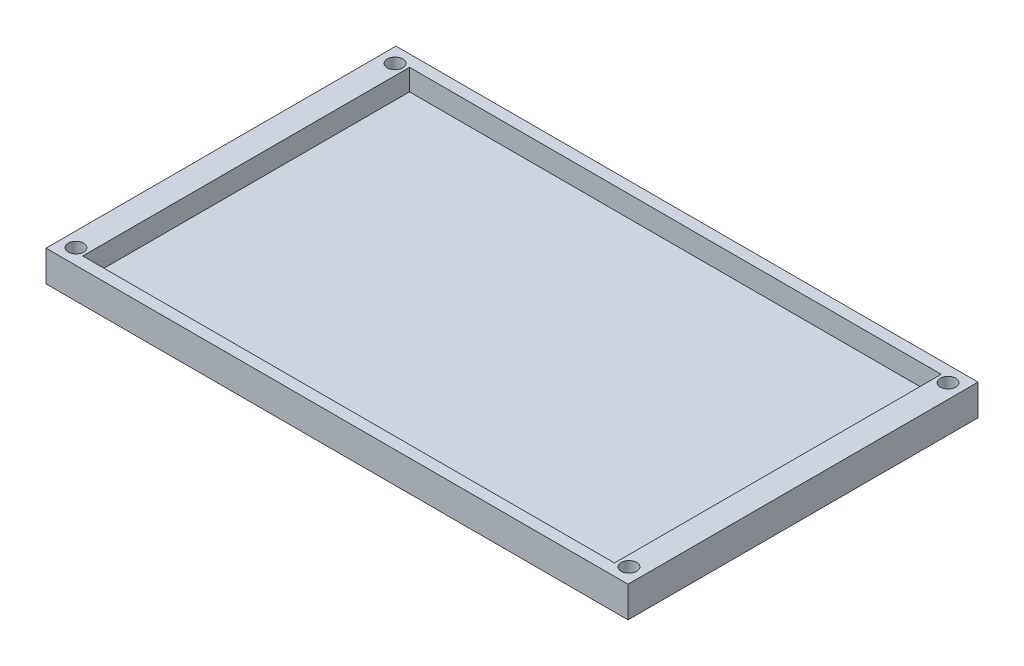
ISO-10303-21;
HEADER;
FILE_DESCRIPTION(('STEP AP214'),'2;1');
FILE_NAME('part.step','',(''),(''),'','','');
FILE_SCHEMA(('AUTOMOTIVE_DESIGN { 1 0 10303 214 1 1 1 1 }'));
ENDSEC;
DATA;
#1=APPLICATION_CONTEXT('core data for automotive mechanical design processes');
#2=APPLICATION_PROTOCOL_DEFINITION('international standard','automotive_design',2000,#1);
#3=PRODUCT_CONTEXT('',#1,'mechanical');
#4=PRODUCT('Part','Part','',(#3));
#5=PRODUCT_RELATED_PRODUCT_CATEGORY('part','',(#4));
#6=PRODUCT_DEFINITION_FORMATION('','',#4);
#7=PRODUCT_DEFINITION_CONTEXT('part definition',#1,'design');
#8=PRODUCT_DEFINITION('design','',#6,#7);
#9=PRODUCT_DEFINITION_SHAPE('','',#8);
#10=(LENGTH_UNIT() NAMED_UNIT(*) SI_UNIT(.MILLI.,.METRE.));
#11=(NAMED_UNIT(*) PLANE_ANGLE_UNIT() SI_UNIT($,.RADIAN.));
#12=(NAMED_UNIT(*) SI_UNIT($,.STERADIAN.) SOLID_ANGLE_UNIT());
#13=UNCERTAINTY_MEASURE_WITH_UNIT(LENGTH_MEASURE(1.E-05),#10,'distance_accuracy_value','');
#14=(GEOMETRIC_REPRESENTATION_CONTEXT(3) GLOBAL_UNCERTAINTY_ASSIGNED_CONTEXT((#13)) GLOBAL_UNIT_ASSIGNED_CONTEXT((#10,
#11,#12)) REPRESENTATION_CONTEXT('',''));
#15=CARTESIAN_POINT('',(0.,0.,0.));
#16=DIRECTION('',(0.,0.,1.));
#17=DIRECTION('',(1.,0.,0.));
#18=AXIS2_PLACEMENT_3D('',#15,#16,#17);
#19=CARTESIAN_POINT('',(-68.75,8.,42.25));
#20=DIRECTION('',(1.,0.,0.));
#21=DIRECTION('',(0.,0.,-1.));
#22=AXIS2_PLACEMENT_3D('',#19,#20,#21);
#23=PLANE('',#22);
#24=DIRECTION('',(0.,-1.,0.));
#25=VECTOR('',#24,1.);
#26=CARTESIAN_POINT('',(-68.75,8.,42.25));
#27=LINE('',#26,#25);
#28=CARTESIAN_POINT('',(-68.75,8.,42.25));
#29=VERTEX_POINT('',#28);
#30=CARTESIAN_POINT('',(-68.75,2.5,42.25));
#31=VERTEX_POINT('',#30);
#32=EDGE_CURVE('E111',#29,#31,#27,.T.);
#33=ORIENTED_EDGE('',*,*,#32,.T.);
#34=DIRECTION('',(0.,0.,1.));
#35=VECTOR('',#34,1.);
#36=CARTESIAN_POINT('',(-68.75,2.5,42.25));
#37=LINE('',#36,#35);
#38=CARTESIAN_POINT('',(-68.75,2.5,-42.25));
#39=VERTEX_POINT('',#38);
#40=EDGE_CURVE('E102',#39,#31,#37,.T.);
#41=ORIENTED_EDGE('',*,*,#40,.F.);
#42=DIRECTION('',(0.,-1.,0.));
#43=VECTOR('',#42,1.);
#44=CARTESIAN_POINT('',(-68.75,8.,-42.25));
#45=LINE('',#44,#43);
#46=CARTESIAN_POINT('',(-68.75,8.,-42.25));
#47=VERTEX_POINT('',#46);
#48=EDGE_CURVE('E108',#47,#39,#45,.T.);
#49=ORIENTED_EDGE('',*,*,#48,.F.);
#50=DIRECTION('',(0.,0.,1.));
#51=VECTOR('',#50,1.);
#52=CARTESIAN_POINT('',(-68.75,8.,42.25));
#53=LINE('',#52,#51);
#54=EDGE_CURVE('E167',#47,#29,#53,.T.);
#55=ORIENTED_EDGE('',*,*,#54,.T.);
#56=EDGE_LOOP('',(#33,#41,#49,#55));
#57=FACE_BOUND('',#56,.T.);
#58=ADVANCED_FACE('F39',(#57),#23,.T.);
#59=CARTESIAN_POINT('',(68.7499999999999,8.,42.25));
#60=DIRECTION('',(0.,0.,-1.));
#61=DIRECTION('',(-1.,0.,0.));
#62=AXIS2_PLACEMENT_3D('',#59,#60,#61);
#63=PLANE('',#62);
#64=DIRECTION('',(0.,-1.,0.));
#65=VECTOR('',#64,1.);
#66=CARTESIAN_POINT('',(68.7499999999999,8.,42.25));
#67=LINE('',#66,#65);
#68=CARTESIAN_POINT('',(68.7499999999999,8.,42.25));
#69=VERTEX_POINT('',#68);
#70=CARTESIAN_POINT('',(68.7499999999999,2.5,42.25));
#71=VERTEX_POINT('',#70);
#72=EDGE_CURVE('E118',#69,#71,#67,.T.);
#73=ORIENTED_EDGE('',*,*,#72,.T.);
#74=DIRECTION('',(-1.,0.,0.));
#75=VECTOR('',#74,1.);
#76=CARTESIAN_POINT('',(69.25,2.5,42.25));
#77=LINE('',#76,#75);
#78=EDGE_CURVE('E112',#71,#31,#77,.T.);
#79=ORIENTED_EDGE('',*,*,#78,.T.);
#80=ORIENTED_EDGE('',*,*,#32,.F.);
#81=DIRECTION('',(1.,0.,0.));
#82=VECTOR('',#81,1.);
#83=CARTESIAN_POINT('',(68.7499999999999,8.,42.25));
#84=LINE('',#83,#82);
#85=EDGE_CURVE('E170',#29,#69,#84,.T.);
#86=ORIENTED_EDGE('',*,*,#85,.T.);
#87=EDGE_LOOP('',(#73,#79,#80,#86));
#88=FACE_BOUND('',#87,.T.);
#89=ADVANCED_FACE('F183',(#88),#63,.T.);
#90=CARTESIAN_POINT('',(68.7499999999999,8.,42.25));
#91=DIRECTION('',(-1.,0.,0.));
#92=DIRECTION('',(0.,0.,1.));
#93=AXIS2_PLACEMENT_3D('',#90,#91,#92);
#94=PLANE('',#93);
#95=DIRECTION('',(0.,-1.,0.));
#96=VECTOR('',#95,1.);
#97=CARTESIAN_POINT('',(68.7499999999999,8.,-42.25));
#98=LINE('',#97,#96);
#99=CARTESIAN_POINT('',(68.7499999999999,8.,-42.25));
#100=VERTEX_POINT('',#99);
#101=CARTESIAN_POINT('',(68.7499999999999,2.5,-42.25));
#102=VERTEX_POINT('',#101);
#103=EDGE_CURVE('E60',#100,#102,#98,.T.);
#104=ORIENTED_EDGE('',*,*,#103,.T.);
#105=DIRECTION('',(0.,0.,1.));
#106=VECTOR('',#105,1.);
#107=CARTESIAN_POINT('',(68.7499999999999,2.5,42.25));
#108=LINE('',#107,#106);
#109=EDGE_CURVE('E54',#102,#71,#108,.T.);
#110=ORIENTED_EDGE('',*,*,#109,.T.);
#111=ORIENTED_EDGE('',*,*,#72,.F.);
#112=DIRECTION('',(0.,0.,-1.));
#113=VECTOR('',#112,1.);
#114=CARTESIAN_POINT('',(68.7499999999999,8.,42.25));
#115=LINE('',#114,#113);
#116=EDGE_CURVE('E120',#69,#100,#115,.T.);
#117=ORIENTED_EDGE('',*,*,#116,.T.);
#118=EDGE_LOOP('',(#104,#110,#111,#117));
#119=FACE_BOUND('',#118,.T.);
#120=ADVANCED_FACE('F178',(#119),#94,.T.);
#121=CARTESIAN_POINT('',(68.7499999999999,8.,-42.25));
#122=DIRECTION('',(0.,0.,1.));
#123=DIRECTION('',(1.,0.,0.));
#124=AXIS2_PLACEMENT_3D('',#121,#122,#123);
#125=PLANE('',#124);
#126=ORIENTED_EDGE('',*,*,#48,.T.);
#127=DIRECTION('',(1.,0.,0.));
#128=VECTOR('',#127,1.);
#129=CARTESIAN_POINT('',(68.7499999999999,2.5,-42.25));
#130=LINE('',#129,#128);
#131=EDGE_CURVE('E11',#39,#102,#130,.T.);
#132=ORIENTED_EDGE('',*,*,#131,.T.);
#133=ORIENTED_EDGE('',*,*,#103,.F.);
#134=DIRECTION('',(-1.,0.,0.));
#135=VECTOR('',#134,1.);
#136=CARTESIAN_POINT('',(68.7499999999999,8.,-42.25));
#137=LINE('',#136,#135);
#138=EDGE_CURVE('E116',#100,#47,#137,.T.);
#139=ORIENTED_EDGE('',*,*,#138,.T.);
#140=EDGE_LOOP('',(#126,#132,#133,#139));
#141=FACE_BOUND('',#140,.T.);
#142=ADVANCED_FACE('F114',(#141),#125,.T.);
#143=CARTESIAN_POINT('',(0.,8.,0.));
#144=DIRECTION('',(0.,-1.,0.));
#145=DIRECTION('',(0.,0.,-1.));
#146=AXIS2_PLACEMENT_3D('',#143,#144,#145);
#147=PLANE('',#146);
#148=CARTESIAN_POINT('',(71.5,8.,-41.25));
#149=DIRECTION('',(0.,1.,0.));
#150=DIRECTION('',(0.,0.,1.));
#151=AXIS2_PLACEMENT_3D('',#148,#149,#150);
#152=CIRCLE('',#151,2.);
#153=CARTESIAN_POINT('',(71.5,8.,-39.25));
#154=VERTEX_POINT('',#153);
#155=EDGE_CURVE('E185',#154,#154,#152,.T.);
#156=ORIENTED_EDGE('',*,*,#155,.F.);
#157=EDGE_LOOP('',(#156));
#158=FACE_BOUND('',#157,.T.);
#159=CARTESIAN_POINT('',(71.5,8.,41.25));
#160=DIRECTION('',(0.,1.,0.));
#161=DIRECTION('',(0.,0.,1.));
#162=AXIS2_PLACEMENT_3D('',#159,#160,#161);
#163=CIRCLE('',#162,2.);
#164=CARTESIAN_POINT('',(71.5,8.,43.25));
#165=VERTEX_POINT('',#164);
#166=EDGE_CURVE('E191',#165,#165,#163,.T.);
#167=ORIENTED_EDGE('',*,*,#166,.F.);
#168=EDGE_LOOP('',(#167));
#169=FACE_BOUND('',#168,.T.);
#170=CARTESIAN_POINT('',(-71.5,8.,41.25));
#171=DIRECTION('',(0.,1.,0.));
#172=DIRECTION('',(0.,0.,1.));
#173=AXIS2_PLACEMENT_3D('',#170,#171,#172);
#174=CIRCLE('',#173,2.);
#175=CARTESIAN_POINT('',(-71.5,8.,43.25));
#176=VERTEX_POINT('',#175);
#177=EDGE_CURVE('E188',#176,#176,#174,.T.);
#178=ORIENTED_EDGE('',*,*,#177,.F.);
#179=EDGE_LOOP('',(#178));
#180=FACE_BOUND('',#179,.T.);
#181=CARTESIAN_POINT('',(-71.5,8.,-41.25));
#182=DIRECTION('',(0.,1.,0.));
#183=DIRECTION('',(0.,0.,1.));
#184=AXIS2_PLACEMENT_3D('',#181,#182,#183);
#185=CIRCLE('',#184,2.);
#186=CARTESIAN_POINT('',(-71.5,8.,-39.25));
#187=VERTEX_POINT('',#186);
#188=EDGE_CURVE('E160',#187,#187,#185,.T.);
#189=ORIENTED_EDGE('',*,*,#188,.F.);
#190=EDGE_LOOP('',(#189));
#191=FACE_BOUND('',#190,.T.);
#192=DIRECTION('',(0.,0.,-1.));
#193=VECTOR('',#192,1.);
#194=CARTESIAN_POINT('',(75.25,8.,45.25));
#195=LINE('',#194,#193);
#196=CARTESIAN_POINT('',(75.25,8.,45.25));
#197=VERTEX_POINT('',#196);
#198=CARTESIAN_POINT('',(75.25,8.,-45.25));
#199=VERTEX_POINT('',#198);
#200=EDGE_CURVE('E128',#197,#199,#195,.T.);
#201=ORIENTED_EDGE('',*,*,#200,.T.);
#202=DIRECTION('',(-1.,0.,0.));
#203=VECTOR('',#202,1.);
#204=CARTESIAN_POINT('',(-75.25,8.,-45.25));
#205=LINE('',#204,#203);
#206=CARTESIAN_POINT('',(-75.25,8.,-45.25));
#207=VERTEX_POINT('',#206);
#208=EDGE_CURVE('E131',#199,#207,#205,.T.);
#209=ORIENTED_EDGE('',*,*,#208,.T.);
#210=DIRECTION('',(0.,0.,1.));
#211=VECTOR('',#210,1.);
#212=CARTESIAN_POINT('',(-75.25,8.,45.25));
#213=LINE('',#212,#211);
#214=CARTESIAN_POINT('',(-75.25,8.,45.25));
#215=VERTEX_POINT('',#214);
#216=EDGE_CURVE('E134',#207,#215,#213,.T.);
#217=ORIENTED_EDGE('',*,*,#216,.T.);
#218=DIRECTION('',(1.,0.,0.));
#219=VECTOR('',#218,1.);
#220=CARTESIAN_POINT('',(-75.25,8.,45.25));
#221=LINE('',#220,#219);
#222=EDGE_CURVE('E136',#215,#197,#221,.T.);
#223=ORIENTED_EDGE('',*,*,#222,.T.);
#224=EDGE_LOOP('',(#201,#209,#217,#223));
#225=FACE_BOUND('',#224,.T.);
#226=ORIENTED_EDGE('',*,*,#54,.F.);
#227=ORIENTED_EDGE('',*,*,#138,.F.);
#228=ORIENTED_EDGE('',*,*,#116,.F.);
#229=ORIENTED_EDGE('',*,*,#85,.F.);
#230=EDGE_LOOP('',(#226,#227,#228,#229));
#231=FACE_BOUND('',#230,.T.);
#232=ADVANCED_FACE('F181',(#158,#169,#180,#191,#225,#231),#147,.F.);
#233=CARTESIAN_POINT('',(0.,0.,0.));
#234=DIRECTION('',(0.,-1.,0.));
#235=DIRECTION('',(0.,0.,-1.));
#236=AXIS2_PLACEMENT_3D('',#233,#234,#235);
#237=PLANE('',#236);
#238=CARTESIAN_POINT('',(71.5,0.,-41.25));
#239=DIRECTION('',(0.,-1.,0.));
#240=DIRECTION('',(0.,0.,-1.));
#241=AXIS2_PLACEMENT_3D('',#238,#239,#240);
#242=CIRCLE('',#241,2.);
#243=CARTESIAN_POINT('',(71.5,0.,-43.25));
#244=VERTEX_POINT('',#243);
#245=EDGE_CURVE('E165',#244,#244,#242,.T.);
#246=ORIENTED_EDGE('',*,*,#245,.F.);
#247=EDGE_LOOP('',(#246));
#248=FACE_BOUND('',#247,.T.);
#249=CARTESIAN_POINT('',(71.5,0.,41.25));
#250=DIRECTION('',(0.,-1.,0.));
#251=DIRECTION('',(0.,0.,-1.));
#252=AXIS2_PLACEMENT_3D('',#249,#250,#251);
#253=CIRCLE('',#252,2.);
#254=CARTESIAN_POINT('',(71.5,0.,39.25));
#255=VERTEX_POINT('',#254);
#256=EDGE_CURVE('E163',#255,#255,#253,.T.);
#257=ORIENTED_EDGE('',*,*,#256,.F.);
#258=EDGE_LOOP('',(#257));
#259=FACE_BOUND('',#258,.T.);
#260=CARTESIAN_POINT('',(-71.5,0.,41.25));
#261=DIRECTION('',(0.,-1.,0.));
#262=DIRECTION('',(0.,0.,-1.));
#263=AXIS2_PLACEMENT_3D('',#260,#261,#262);
#264=CIRCLE('',#263,2.);
#265=CARTESIAN_POINT('',(-71.5,0.,39.25));
#266=VERTEX_POINT('',#265);
#267=EDGE_CURVE('E159',#266,#266,#264,.T.);
#268=ORIENTED_EDGE('',*,*,#267,.F.);
#269=EDGE_LOOP('',(#268));
#270=FACE_BOUND('',#269,.T.);
#271=CARTESIAN_POINT('',(-71.5,0.,-41.25));
#272=DIRECTION('',(0.,-1.,0.));
#273=DIRECTION('',(0.,0.,-1.));
#274=AXIS2_PLACEMENT_3D('',#271,#272,#273);
#275=CIRCLE('',#274,2.);
#276=CARTESIAN_POINT('',(-71.5,0.,-43.25));
#277=VERTEX_POINT('',#276);
#278=EDGE_CURVE('E156',#277,#277,#275,.T.);
#279=ORIENTED_EDGE('',*,*,#278,.F.);
#280=EDGE_LOOP('',(#279));
#281=FACE_BOUND('',#280,.T.);
#282=DIRECTION('',(0.,0.,-1.));
#283=VECTOR('',#282,1.);
#284=CARTESIAN_POINT('',(75.25,0.,45.25));
#285=LINE('',#284,#283);
#286=CARTESIAN_POINT('',(75.25,0.,45.25));
#287=VERTEX_POINT('',#286);
#288=CARTESIAN_POINT('',(75.25,0.,-45.25));
#289=VERTEX_POINT('',#288);
#290=EDGE_CURVE('E127',#287,#289,#285,.T.);
#291=ORIENTED_EDGE('',*,*,#290,.F.);
#292=DIRECTION('',(1.,0.,0.));
#293=VECTOR('',#292,1.);
#294=CARTESIAN_POINT('',(-75.25,0.,45.25));
#295=LINE('',#294,#293);
#296=CARTESIAN_POINT('',(-75.25,0.,45.25));
#297=VERTEX_POINT('',#296);
#298=EDGE_CURVE('E132',#297,#287,#295,.T.);
#299=ORIENTED_EDGE('',*,*,#298,.F.);
#300=DIRECTION('',(0.,0.,1.));
#301=VECTOR('',#300,1.);
#302=CARTESIAN_POINT('',(-75.25,0.,45.25));
#303=LINE('',#302,#301);
#304=CARTESIAN_POINT('',(-75.25,0.,-45.25));
#305=VERTEX_POINT('',#304);
#306=EDGE_CURVE('E143',#305,#297,#303,.T.);
#307=ORIENTED_EDGE('',*,*,#306,.F.);
#308=DIRECTION('',(-1.,0.,0.));
#309=VECTOR('',#308,1.);
#310=CARTESIAN_POINT('',(-75.25,0.,-45.25));
#311=LINE('',#310,#309);
#312=EDGE_CURVE('E141',#289,#305,#311,.T.);
#313=ORIENTED_EDGE('',*,*,#312,.F.);
#314=EDGE_LOOP('',(#291,#299,#307,#313));
#315=FACE_BOUND('',#314,.T.);
#316=ADVANCED_FACE('F200',(#248,#259,#270,#281,#315),#237,.T.);
#317=CARTESIAN_POINT('',(75.25,8.,45.25));
#318=DIRECTION('',(-1.,0.,0.));
#319=DIRECTION('',(0.,0.,1.));
#320=AXIS2_PLACEMENT_3D('',#317,#318,#319);
#321=PLANE('',#320);
#322=ORIENTED_EDGE('',*,*,#290,.T.);
#323=DIRECTION('',(0.,-1.,0.));
#324=VECTOR('',#323,1.);
#325=CARTESIAN_POINT('',(75.25,8.,-45.25));
#326=LINE('',#325,#324);
#327=EDGE_CURVE('E47',#199,#289,#326,.T.);
#328=ORIENTED_EDGE('',*,*,#327,.F.);
#329=ORIENTED_EDGE('',*,*,#200,.F.);
#330=DIRECTION('',(0.,-1.,0.));
#331=VECTOR('',#330,1.);
#332=CARTESIAN_POINT('',(75.25,8.,45.25));
#333=LINE('',#332,#331);
#334=EDGE_CURVE('E138',#197,#287,#333,.T.);
#335=ORIENTED_EDGE('',*,*,#334,.T.);
#336=EDGE_LOOP('',(#322,#328,#329,#335));
#337=FACE_BOUND('',#336,.T.);
#338=ADVANCED_FACE('F41',(#337),#321,.F.);
#339=CARTESIAN_POINT('',(-75.25,8.,-45.25));
#340=DIRECTION('',(0.,0.,1.));
#341=DIRECTION('',(1.,0.,0.));
#342=AXIS2_PLACEMENT_3D('',#339,#340,#341);
#343=PLANE('',#342);
#344=ORIENTED_EDGE('',*,*,#312,.T.);
#345=DIRECTION('',(0.,-1.,0.));
#346=VECTOR('',#345,1.);
#347=CARTESIAN_POINT('',(-75.25,8.,-45.25));
#348=LINE('',#347,#346);
#349=EDGE_CURVE('E151',#207,#305,#348,.T.);
#350=ORIENTED_EDGE('',*,*,#349,.F.);
#351=ORIENTED_EDGE('',*,*,#208,.F.);
#352=ORIENTED_EDGE('',*,*,#327,.T.);
#353=EDGE_LOOP('',(#344,#350,#351,#352));
#354=FACE_BOUND('',#353,.T.);
#355=ADVANCED_FACE('F217',(#354),#343,.F.);
#356=CARTESIAN_POINT('',(-75.25,8.,45.25));
#357=DIRECTION('',(1.,0.,0.));
#358=DIRECTION('',(0.,0.,-1.));
#359=AXIS2_PLACEMENT_3D('',#356,#357,#358);
#360=PLANE('',#359);
#361=ORIENTED_EDGE('',*,*,#306,.T.);
#362=DIRECTION('',(0.,-1.,0.));
#363=VECTOR('',#362,1.);
#364=CARTESIAN_POINT('',(-75.25,8.,45.25));
#365=LINE('',#364,#363);
#366=EDGE_CURVE('E148',#215,#297,#365,.T.);
#367=ORIENTED_EDGE('',*,*,#366,.F.);
#368=ORIENTED_EDGE('',*,*,#216,.F.);
#369=ORIENTED_EDGE('',*,*,#349,.T.);
#370=EDGE_LOOP('',(#361,#367,#368,#369));
#371=FACE_BOUND('',#370,.T.);
#372=ADVANCED_FACE('F222',(#371),#360,.F.);
#373=CARTESIAN_POINT('',(-75.25,8.,45.25));
#374=DIRECTION('',(0.,0.,-1.));
#375=DIRECTION('',(-1.,0.,0.));
#376=AXIS2_PLACEMENT_3D('',#373,#374,#375);
#377=PLANE('',#376);
#378=ORIENTED_EDGE('',*,*,#298,.T.);
#379=ORIENTED_EDGE('',*,*,#334,.F.);
#380=ORIENTED_EDGE('',*,*,#222,.F.);
#381=ORIENTED_EDGE('',*,*,#366,.T.);
#382=EDGE_LOOP('',(#378,#379,#380,#381));
#383=FACE_BOUND('',#382,.T.);
#384=ADVANCED_FACE('F225',(#383),#377,.F.);
#385=CARTESIAN_POINT('',(-71.5,-31.,-41.25));
#386=DIRECTION('',(0.,1.,0.));
#387=DIRECTION('',(0.,0.,1.));
#388=AXIS2_PLACEMENT_3D('',#385,#386,#387);
#389=CYLINDRICAL_SURFACE('',#388,2.);
#390=ORIENTED_EDGE('',*,*,#278,.T.);
#391=EDGE_LOOP('',(#390));
#392=FACE_BOUND('',#391,.T.);
#393=ORIENTED_EDGE('',*,*,#188,.T.);
#394=EDGE_LOOP('',(#393));
#395=FACE_BOUND('',#394,.T.);
#396=ADVANCED_FACE('F248',(#392,#395),#389,.F.);
#397=CARTESIAN_POINT('',(-71.5,-31.,41.25));
#398=DIRECTION('',(0.,1.,0.));
#399=DIRECTION('',(0.,0.,1.));
#400=AXIS2_PLACEMENT_3D('',#397,#398,#399);
#401=CYLINDRICAL_SURFACE('',#400,2.);
#402=ORIENTED_EDGE('',*,*,#267,.T.);
#403=EDGE_LOOP('',(#402));
#404=FACE_BOUND('',#403,.T.);
#405=ORIENTED_EDGE('',*,*,#177,.T.);
#406=EDGE_LOOP('',(#405));
#407=FACE_BOUND('',#406,.T.);
#408=ADVANCED_FACE('F251',(#404,#407),#401,.F.);
#409=CARTESIAN_POINT('',(71.5,-31.,41.25));
#410=DIRECTION('',(0.,1.,0.));
#411=DIRECTION('',(0.,0.,1.));
#412=AXIS2_PLACEMENT_3D('',#409,#410,#411);
#413=CYLINDRICAL_SURFACE('',#412,2.);
#414=ORIENTED_EDGE('',*,*,#256,.T.);
#415=EDGE_LOOP('',(#414));
#416=FACE_BOUND('',#415,.T.);
#417=ORIENTED_EDGE('',*,*,#166,.T.);
#418=EDGE_LOOP('',(#417));
#419=FACE_BOUND('',#418,.T.);
#420=ADVANCED_FACE('F254',(#416,#419),#413,.F.);
#421=CARTESIAN_POINT('',(71.5,-31.,-41.25));
#422=DIRECTION('',(0.,1.,0.));
#423=DIRECTION('',(0.,0.,1.));
#424=AXIS2_PLACEMENT_3D('',#421,#422,#423);
#425=CYLINDRICAL_SURFACE('',#424,2.);
#426=ORIENTED_EDGE('',*,*,#245,.T.);
#427=EDGE_LOOP('',(#426));
#428=FACE_BOUND('',#427,.T.);
#429=ORIENTED_EDGE('',*,*,#155,.T.);
#430=EDGE_LOOP('',(#429));
#431=FACE_BOUND('',#430,.T.);
#432=ADVANCED_FACE('F196',(#428,#431),#425,.F.);
#433=CARTESIAN_POINT('',(69.25,2.5,42.25));
#434=DIRECTION('',(0.,-1.,0.));
#435=DIRECTION('',(0.,0.,-1.));
#436=AXIS2_PLACEMENT_3D('',#433,#434,#435);
#437=PLANE('',#436);
#438=ORIENTED_EDGE('',*,*,#109,.F.);
#439=ORIENTED_EDGE('',*,*,#131,.F.);
#440=ORIENTED_EDGE('',*,*,#40,.T.);
#441=ORIENTED_EDGE('',*,*,#78,.F.);
#442=EDGE_LOOP('',(#438,#439,#440,#441));
#443=FACE_BOUND('',#442,.T.);
#444=ADVANCED_FACE('F101',(#443),#437,.F.);
#445=CLOSED_SHELL('',(#58,#89,#120,#142,#232,#316,#338,#355,#372,#384,#396,#408,#420,#432,#444));
#446=MANIFOLD_SOLID_BREP('B2',#445);
#447=ADVANCED_BREP_SHAPE_REPRESENTATION('',(#18,#446),#14);
#448=SHAPE_DEFINITION_REPRESENTATION(#9,#447);
ENDSEC;
END-ISO-10303-21;
